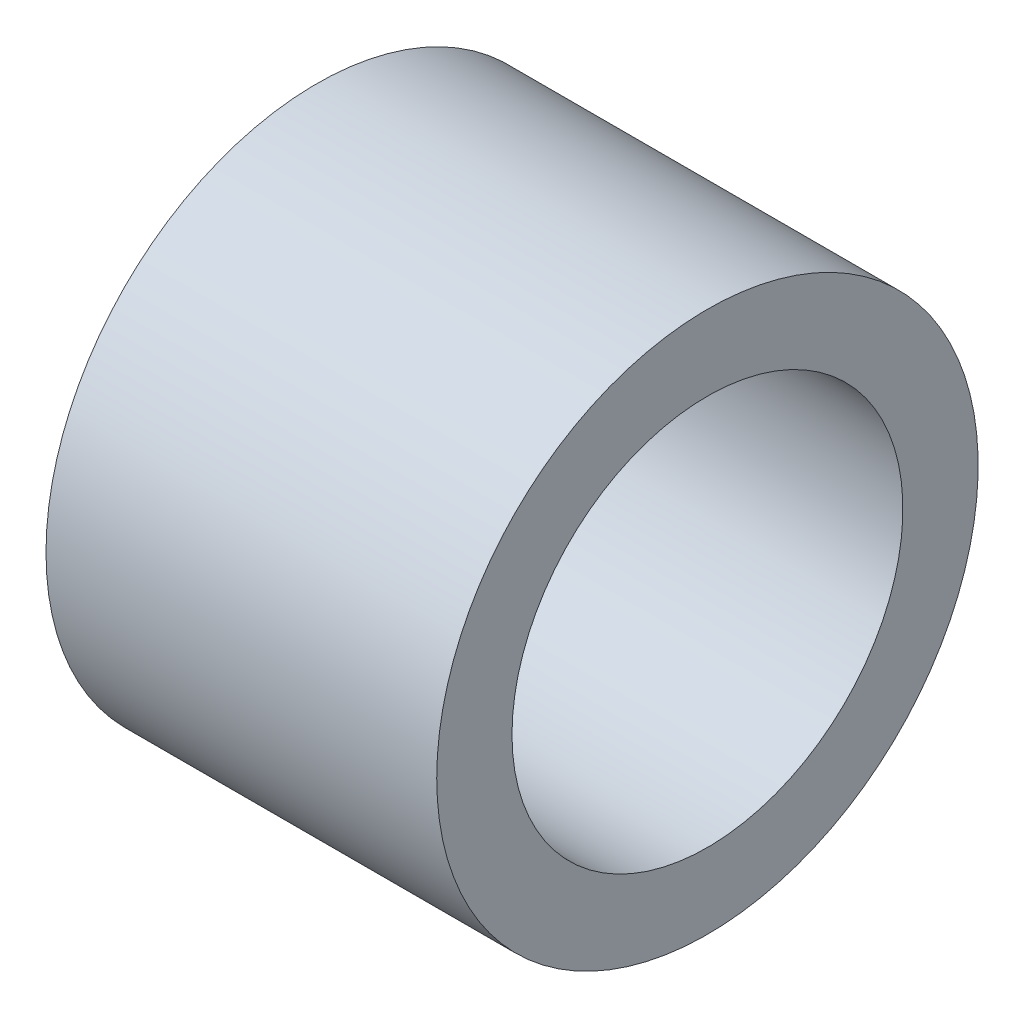
ISO-10303-21;
HEADER;
FILE_DESCRIPTION(('STEP AP214'),'2;1');
FILE_NAME('part.step','',(''),(''),'','','');
FILE_SCHEMA(('AUTOMOTIVE_DESIGN { 1 0 10303 214 1 1 1 1 }'));
ENDSEC;
DATA;
#1=APPLICATION_CONTEXT('core data for automotive mechanical design processes');
#2=APPLICATION_PROTOCOL_DEFINITION('international standard','automotive_design',2000,#1);
#3=PRODUCT_CONTEXT('',#1,'mechanical');
#4=PRODUCT('Part','Part','',(#3));
#5=PRODUCT_RELATED_PRODUCT_CATEGORY('part','',(#4));
#6=PRODUCT_DEFINITION_FORMATION('','',#4);
#7=PRODUCT_DEFINITION_CONTEXT('part definition',#1,'design');
#8=PRODUCT_DEFINITION('design','',#6,#7);
#9=PRODUCT_DEFINITION_SHAPE('','',#8);
#10=(LENGTH_UNIT() NAMED_UNIT(*) SI_UNIT(.MILLI.,.METRE.));
#11=(NAMED_UNIT(*) PLANE_ANGLE_UNIT() SI_UNIT($,.RADIAN.));
#12=(NAMED_UNIT(*) SI_UNIT($,.STERADIAN.) SOLID_ANGLE_UNIT());
#13=UNCERTAINTY_MEASURE_WITH_UNIT(LENGTH_MEASURE(1.E-05),#10,'distance_accuracy_value','');
#14=(GEOMETRIC_REPRESENTATION_CONTEXT(3) GLOBAL_UNCERTAINTY_ASSIGNED_CONTEXT((#13)) GLOBAL_UNIT_ASSIGNED_CONTEXT((#10,
#11,#12)) REPRESENTATION_CONTEXT('',''));
#15=CARTESIAN_POINT('',(0.,0.,0.));
#16=DIRECTION('',(0.,0.,1.));
#17=DIRECTION('',(1.,0.,0.));
#18=AXIS2_PLACEMENT_3D('',#15,#16,#17);
#19=CARTESIAN_POINT('',(9.525,0.,0.));
#20=DIRECTION('',(1.,0.,0.));
#21=DIRECTION('',(0.,0.,-1.));
#22=AXIS2_PLACEMENT_3D('',#19,#20,#21);
#23=PLANE('',#22);
#24=CARTESIAN_POINT('',(9.525,0.,0.));
#25=DIRECTION('',(1.,0.,0.));
#26=DIRECTION('',(0.,0.,-1.));
#27=AXIS2_PLACEMENT_3D('',#24,#25,#26);
#28=CIRCLE('',#27,13.2);
#29=CARTESIAN_POINT('',(9.525,0.,13.2));
#30=VERTEX_POINT('',#29);
#31=EDGE_CURVE('E10',#30,#30,#28,.T.);
#32=ORIENTED_EDGE('',*,*,#31,.T.);
#33=EDGE_LOOP('',(#32));
#34=FACE_BOUND('',#33,.T.);
#35=CARTESIAN_POINT('',(9.525,0.,0.));
#36=DIRECTION('',(1.,0.,0.));
#37=DIRECTION('',(0.,0.,-1.));
#38=AXIS2_PLACEMENT_3D('',#35,#36,#37);
#39=CIRCLE('',#38,9.53);
#40=CARTESIAN_POINT('',(9.525,0.,9.53));
#41=VERTEX_POINT('',#40);
#42=EDGE_CURVE('E54',#41,#41,#39,.T.);
#43=ORIENTED_EDGE('',*,*,#42,.F.);
#44=EDGE_LOOP('',(#43));
#45=FACE_BOUND('',#44,.T.);
#46=ADVANCED_FACE('F41',(#34,#45),#23,.T.);
#47=CARTESIAN_POINT('',(-9.525,0.,0.));
#48=DIRECTION('',(1.,0.,0.));
#49=DIRECTION('',(0.,0.,-1.));
#50=AXIS2_PLACEMENT_3D('',#47,#48,#49);
#51=PLANE('',#50);
#52=CARTESIAN_POINT('',(-9.525,0.,0.));
#53=DIRECTION('',(1.,0.,0.));
#54=DIRECTION('',(0.,0.,-1.));
#55=AXIS2_PLACEMENT_3D('',#52,#53,#54);
#56=CIRCLE('',#55,13.2);
#57=CARTESIAN_POINT('',(-9.525,0.,13.2));
#58=VERTEX_POINT('',#57);
#59=EDGE_CURVE('E45',#58,#58,#56,.T.);
#60=ORIENTED_EDGE('',*,*,#59,.F.);
#61=EDGE_LOOP('',(#60));
#62=FACE_BOUND('',#61,.T.);
#63=CARTESIAN_POINT('',(-9.525,0.,0.));
#64=DIRECTION('',(1.,0.,0.));
#65=DIRECTION('',(0.,0.,-1.));
#66=AXIS2_PLACEMENT_3D('',#63,#64,#65);
#67=CIRCLE('',#66,9.53);
#68=CARTESIAN_POINT('',(-9.525,0.,9.53));
#69=VERTEX_POINT('',#68);
#70=EDGE_CURVE('E56',#69,#69,#67,.T.);
#71=ORIENTED_EDGE('',*,*,#70,.T.);
#72=EDGE_LOOP('',(#71));
#73=FACE_BOUND('',#72,.T.);
#74=ADVANCED_FACE('F68',(#62,#73),#51,.F.);
#75=CARTESIAN_POINT('',(9.525,0.,0.));
#76=DIRECTION('',(-1.,0.,0.));
#77=DIRECTION('',(0.,0.,1.));
#78=AXIS2_PLACEMENT_3D('',#75,#76,#77);
#79=CYLINDRICAL_SURFACE('',#78,13.2);
#80=CARTESIAN_POINT('',(9.525,0.,13.2));
#81=CARTESIAN_POINT('',(9.3265625,0.,13.2));
#82=CARTESIAN_POINT('',(9.128125,0.,13.2));
#83=CARTESIAN_POINT('',(8.73125,0.,13.2));
#84=CARTESIAN_POINT('',(8.5328125,0.,13.2));
#85=CARTESIAN_POINT('',(8.1359375,0.,13.2));
#86=CARTESIAN_POINT('',(7.9375,0.,13.2));
#87=CARTESIAN_POINT('',(7.540625,0.,13.2));
#88=CARTESIAN_POINT('',(7.3421875,0.,13.2));
#89=CARTESIAN_POINT('',(6.9453125,0.,13.2));
#90=CARTESIAN_POINT('',(6.746875,0.,13.2));
#91=CARTESIAN_POINT('',(6.35,0.,13.2));
#92=CARTESIAN_POINT('',(6.1515625,0.,13.2));
#93=CARTESIAN_POINT('',(5.7546875,0.,13.2));
#94=CARTESIAN_POINT('',(5.55625,0.,13.2));
#95=CARTESIAN_POINT('',(5.159375,0.,13.2));
#96=CARTESIAN_POINT('',(4.9609375,0.,13.2));
#97=CARTESIAN_POINT('',(4.5640625,0.,13.2));
#98=CARTESIAN_POINT('',(4.365625,0.,13.2));
#99=CARTESIAN_POINT('',(3.96875,0.,13.2));
#100=CARTESIAN_POINT('',(3.7703125,0.,13.2));
#101=CARTESIAN_POINT('',(3.3734375,0.,13.2));
#102=CARTESIAN_POINT('',(3.175,0.,13.2));
#103=CARTESIAN_POINT('',(2.778125,0.,13.2));
#104=CARTESIAN_POINT('',(2.5796875,0.,13.2));
#105=CARTESIAN_POINT('',(2.1828125,0.,13.2));
#106=CARTESIAN_POINT('',(1.984375,0.,13.2));
#107=CARTESIAN_POINT('',(1.5875,0.,13.2));
#108=CARTESIAN_POINT('',(1.3890625,0.,13.2));
#109=CARTESIAN_POINT('',(0.992187499999999,0.,13.2));
#110=CARTESIAN_POINT('',(0.793749999999999,0.,13.2));
#111=CARTESIAN_POINT('',(0.396874999999998,0.,13.2));
#112=CARTESIAN_POINT('',(0.198437499999998,0.,13.2));
#113=CARTESIAN_POINT('',(-0.198437500000002,0.,13.2));
#114=CARTESIAN_POINT('',(-0.396875000000002,0.,13.2));
#115=CARTESIAN_POINT('',(-0.793750000000002,0.,13.2));
#116=CARTESIAN_POINT('',(-0.992187500000002,0.,13.2));
#117=CARTESIAN_POINT('',(-1.3890625,0.,13.2));
#118=CARTESIAN_POINT('',(-1.5875,0.,13.2));
#119=CARTESIAN_POINT('',(-1.984375,0.,13.2));
#120=CARTESIAN_POINT('',(-2.1828125,0.,13.2));
#121=CARTESIAN_POINT('',(-2.5796875,0.,13.2));
#122=CARTESIAN_POINT('',(-2.778125,0.,13.2));
#123=CARTESIAN_POINT('',(-3.175,0.,13.2));
#124=CARTESIAN_POINT('',(-3.3734375,0.,13.2));
#125=CARTESIAN_POINT('',(-3.7703125,0.,13.2));
#126=CARTESIAN_POINT('',(-3.96875,0.,13.2));
#127=CARTESIAN_POINT('',(-4.365625,0.,13.2));
#128=CARTESIAN_POINT('',(-4.5640625,0.,13.2));
#129=CARTESIAN_POINT('',(-4.9609375,0.,13.2));
#130=CARTESIAN_POINT('',(-5.159375,0.,13.2));
#131=CARTESIAN_POINT('',(-5.55625,0.,13.2));
#132=CARTESIAN_POINT('',(-5.7546875,0.,13.2));
#133=CARTESIAN_POINT('',(-6.1515625,0.,13.2));
#134=CARTESIAN_POINT('',(-6.35,0.,13.2));
#135=CARTESIAN_POINT('',(-6.746875,0.,13.2));
#136=CARTESIAN_POINT('',(-6.9453125,0.,13.2));
#137=CARTESIAN_POINT('',(-7.3421875,0.,13.2));
#138=CARTESIAN_POINT('',(-7.540625,0.,13.2));
#139=CARTESIAN_POINT('',(-7.9375,0.,13.2));
#140=CARTESIAN_POINT('',(-8.1359375,0.,13.2));
#141=CARTESIAN_POINT('',(-8.5328125,0.,13.2));
#142=CARTESIAN_POINT('',(-8.73125,0.,13.2));
#143=CARTESIAN_POINT('',(-9.128125,0.,13.2));
#144=CARTESIAN_POINT('',(-9.3265625,0.,13.2));
#145=CARTESIAN_POINT('',(-9.525,0.,13.2));
#146=B_SPLINE_CURVE_WITH_KNOTS('',3,(#80,#81,#82,#83,#84,#85,#86,#87,#88,#89,#90,#91,#92,#93,
#94,#95,#96,#97,#98,#99,#100,#101,#102,#103,#104,#105,#106,#107,#108,#109,#110,#111,#112,#113,
#114,#115,#116,#117,#118,#119,#120,#121,#122,#123,#124,#125,#126,#127,#128,#129,#130,#131,#132,
#133,#134,#135,#136,#137,#138,#139,#140,#141,#142,#143,#144,#145),.UNSPECIFIED.,.F.,.F.,(4,2,2,
2,2,2,2,2,2,2,2,2,2,2,2,2,2,2,2,2,2,2,2,2,2,2,2,2,2,2,2,2,4),(0.,0.595312499999999,1.190625,
1.7859375,2.38125,2.9765625,3.571875,4.1671875,4.7625,5.3578125,5.953125,6.5484375,7.14375,
7.7390625,8.334375,8.9296875,9.525,10.1203125,10.715625,11.3109375,11.90625,12.5015625,
13.096875,13.6921875,14.2875,14.8828125,15.478125,16.0734375,16.66875,17.2640625,17.859375,
18.4546875,19.05),.UNSPECIFIED.);
#147=EDGE_CURVE('BSEAM43',#30,#58,#146,.T.);
#148=ORIENTED_EDGE('',*,*,#31,.F.);
#149=ORIENTED_EDGE('',*,*,#59,.T.);
#150=ORIENTED_EDGE('',*,*,#147,.T.);
#151=ORIENTED_EDGE('',*,*,#147,.F.);
#152=EDGE_LOOP('',(#148,#150,#149,#151));
#153=FACE_BOUND('',#152,.T.);
#154=ADVANCED_FACE('F43',(#153),#79,.T.);
#155=CARTESIAN_POINT('',(9.525,0.,0.));
#156=DIRECTION('',(-1.,0.,0.));
#157=DIRECTION('',(0.,0.,1.));
#158=AXIS2_PLACEMENT_3D('',#155,#156,#157);
#159=CYLINDRICAL_SURFACE('',#158,9.53);
#160=CARTESIAN_POINT('',(9.525,0.,9.53));
#161=CARTESIAN_POINT('',(9.3265625,0.,9.53));
#162=CARTESIAN_POINT('',(9.128125,0.,9.53));
#163=CARTESIAN_POINT('',(8.73125,0.,9.53));
#164=CARTESIAN_POINT('',(8.5328125,0.,9.53));
#165=CARTESIAN_POINT('',(8.1359375,0.,9.53));
#166=CARTESIAN_POINT('',(7.9375,0.,9.53));
#167=CARTESIAN_POINT('',(7.540625,0.,9.53));
#168=CARTESIAN_POINT('',(7.3421875,0.,9.53));
#169=CARTESIAN_POINT('',(6.9453125,0.,9.53));
#170=CARTESIAN_POINT('',(6.746875,0.,9.53));
#171=CARTESIAN_POINT('',(6.35,0.,9.53));
#172=CARTESIAN_POINT('',(6.1515625,0.,9.53));
#173=CARTESIAN_POINT('',(5.7546875,0.,9.53));
#174=CARTESIAN_POINT('',(5.55625,0.,9.53));
#175=CARTESIAN_POINT('',(5.159375,0.,9.53));
#176=CARTESIAN_POINT('',(4.9609375,0.,9.53));
#177=CARTESIAN_POINT('',(4.5640625,0.,9.53));
#178=CARTESIAN_POINT('',(4.365625,0.,9.53));
#179=CARTESIAN_POINT('',(3.96875,0.,9.53));
#180=CARTESIAN_POINT('',(3.7703125,0.,9.53));
#181=CARTESIAN_POINT('',(3.3734375,0.,9.53));
#182=CARTESIAN_POINT('',(3.175,0.,9.53));
#183=CARTESIAN_POINT('',(2.778125,0.,9.53));
#184=CARTESIAN_POINT('',(2.5796875,0.,9.53));
#185=CARTESIAN_POINT('',(2.1828125,0.,9.53));
#186=CARTESIAN_POINT('',(1.984375,0.,9.53));
#187=CARTESIAN_POINT('',(1.5875,0.,9.53));
#188=CARTESIAN_POINT('',(1.3890625,0.,9.53));
#189=CARTESIAN_POINT('',(0.992187499999999,0.,9.53));
#190=CARTESIAN_POINT('',(0.793749999999999,0.,9.53));
#191=CARTESIAN_POINT('',(0.396874999999998,0.,9.53));
#192=CARTESIAN_POINT('',(0.198437499999998,0.,9.53));
#193=CARTESIAN_POINT('',(-0.198437500000002,0.,9.53));
#194=CARTESIAN_POINT('',(-0.396875000000002,0.,9.53));
#195=CARTESIAN_POINT('',(-0.793750000000002,0.,9.53));
#196=CARTESIAN_POINT('',(-0.992187500000002,0.,9.53));
#197=CARTESIAN_POINT('',(-1.3890625,0.,9.53));
#198=CARTESIAN_POINT('',(-1.5875,0.,9.53));
#199=CARTESIAN_POINT('',(-1.984375,0.,9.53));
#200=CARTESIAN_POINT('',(-2.1828125,0.,9.53));
#201=CARTESIAN_POINT('',(-2.5796875,0.,9.53));
#202=CARTESIAN_POINT('',(-2.778125,0.,9.53));
#203=CARTESIAN_POINT('',(-3.175,0.,9.53));
#204=CARTESIAN_POINT('',(-3.3734375,0.,9.53));
#205=CARTESIAN_POINT('',(-3.7703125,0.,9.53));
#206=CARTESIAN_POINT('',(-3.96875,0.,9.53));
#207=CARTESIAN_POINT('',(-4.365625,0.,9.53));
#208=CARTESIAN_POINT('',(-4.5640625,0.,9.53));
#209=CARTESIAN_POINT('',(-4.9609375,0.,9.53));
#210=CARTESIAN_POINT('',(-5.159375,0.,9.53));
#211=CARTESIAN_POINT('',(-5.55625,0.,9.53));
#212=CARTESIAN_POINT('',(-5.7546875,0.,9.53));
#213=CARTESIAN_POINT('',(-6.1515625,0.,9.53));
#214=CARTESIAN_POINT('',(-6.35,0.,9.53));
#215=CARTESIAN_POINT('',(-6.746875,0.,9.53));
#216=CARTESIAN_POINT('',(-6.9453125,0.,9.53));
#217=CARTESIAN_POINT('',(-7.3421875,0.,9.53));
#218=CARTESIAN_POINT('',(-7.540625,0.,9.53));
#219=CARTESIAN_POINT('',(-7.9375,0.,9.53));
#220=CARTESIAN_POINT('',(-8.1359375,0.,9.53));
#221=CARTESIAN_POINT('',(-8.5328125,0.,9.53));
#222=CARTESIAN_POINT('',(-8.73125,0.,9.53));
#223=CARTESIAN_POINT('',(-9.128125,0.,9.53));
#224=CARTESIAN_POINT('',(-9.3265625,0.,9.53));
#225=CARTESIAN_POINT('',(-9.525,0.,9.53));
#226=B_SPLINE_CURVE_WITH_KNOTS('',3,(#160,#161,#162,#163,#164,#165,#166,#167,#168,#169,#170,
#171,#172,#173,#174,#175,#176,#177,#178,#179,#180,#181,#182,#183,#184,#185,#186,#187,#188,#189,
#190,#191,#192,#193,#194,#195,#196,#197,#198,#199,#200,#201,#202,#203,#204,#205,#206,#207,#208,
#209,#210,#211,#212,#213,#214,#215,#216,#217,#218,#219,#220,#221,#222,#223,#224,#225),
.UNSPECIFIED.,.F.,.F.,(4,2,2,2,2,2,2,2,2,2,2,2,2,2,2,2,2,2,2,2,2,2,2,2,2,2,2,2,2,2,2,2,4),(0.,
0.595312499999999,1.190625,1.7859375,2.38125,2.9765625,3.571875,4.1671875,4.7625,5.3578125,
5.953125,6.5484375,7.14375,7.7390625,8.334375,8.9296875,9.525,10.1203125,10.715625,11.3109375,
11.90625,12.5015625,13.096875,13.6921875,14.2875,14.8828125,15.478125,16.0734375,16.66875,
17.2640625,17.859375,18.4546875,19.05),.UNSPECIFIED.);
#227=EDGE_CURVE('BSEAM64',#41,#69,#226,.T.);
#228=ORIENTED_EDGE('',*,*,#42,.T.);
#229=ORIENTED_EDGE('',*,*,#70,.F.);
#230=ORIENTED_EDGE('',*,*,#227,.T.);
#231=ORIENTED_EDGE('',*,*,#227,.F.);
#232=EDGE_LOOP('',(#228,#230,#229,#231));
#233=FACE_BOUND('',#232,.T.);
#234=ADVANCED_FACE('F64',(#233),#159,.F.);
#235=CLOSED_SHELL('',(#46,#74,#154,#234));
#236=MANIFOLD_SOLID_BREP('B2',#235);
#237=ADVANCED_BREP_SHAPE_REPRESENTATION('',(#18,#236),#14);
#238=SHAPE_DEFINITION_REPRESENTATION(#9,#237);
ENDSEC;
END-ISO-10303-21;
